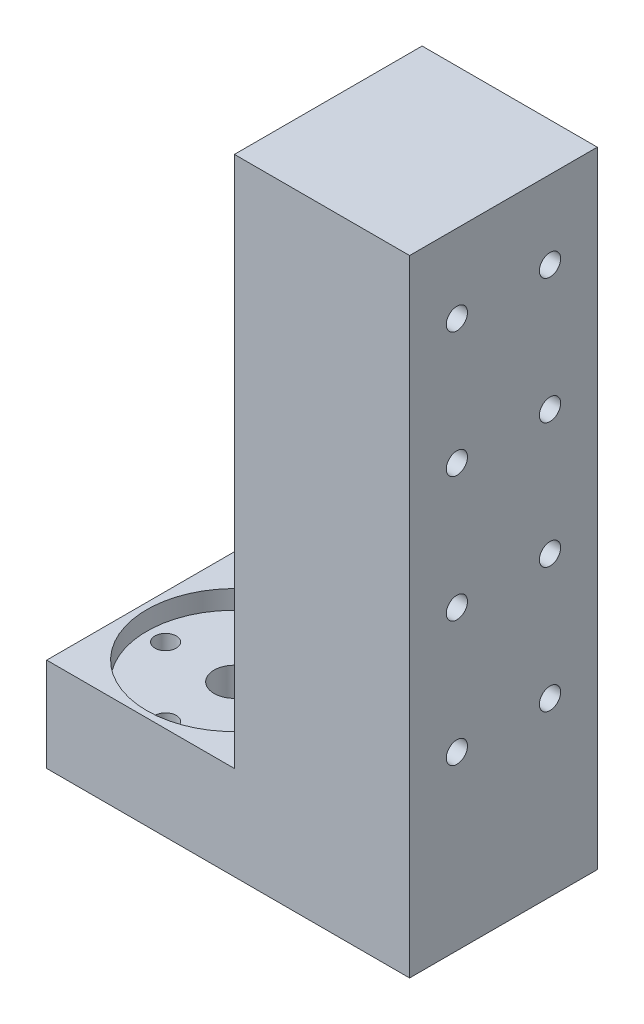
ISO-10303-21;
HEADER;
FILE_DESCRIPTION(('STEP AP214'),'2;1');
FILE_NAME('part.step','',(''),(''),'','','');
FILE_SCHEMA(('AUTOMOTIVE_DESIGN { 1 0 10303 214 1 1 1 1 }'));
ENDSEC;
DATA;
#1=APPLICATION_CONTEXT('core data for automotive mechanical design processes');
#2=APPLICATION_PROTOCOL_DEFINITION('international standard','automotive_design',2000,#1);
#3=PRODUCT_CONTEXT('',#1,'mechanical');
#4=PRODUCT('Part','Part','',(#3));
#5=PRODUCT_RELATED_PRODUCT_CATEGORY('part','',(#4));
#6=PRODUCT_DEFINITION_FORMATION('','',#4);
#7=PRODUCT_DEFINITION_CONTEXT('part definition',#1,'design');
#8=PRODUCT_DEFINITION('design','',#6,#7);
#9=PRODUCT_DEFINITION_SHAPE('','',#8);
#10=(LENGTH_UNIT() NAMED_UNIT(*) SI_UNIT(.MILLI.,.METRE.));
#11=(NAMED_UNIT(*) PLANE_ANGLE_UNIT() SI_UNIT($,.RADIAN.));
#12=(NAMED_UNIT(*) SI_UNIT($,.STERADIAN.) SOLID_ANGLE_UNIT());
#13=UNCERTAINTY_MEASURE_WITH_UNIT(LENGTH_MEASURE(1.E-05),#10,'distance_accuracy_value','');
#14=(GEOMETRIC_REPRESENTATION_CONTEXT(3) GLOBAL_UNCERTAINTY_ASSIGNED_CONTEXT((#13)) GLOBAL_UNIT_ASSIGNED_CONTEXT((#10,
#11,#12)) REPRESENTATION_CONTEXT('',''));
#15=CARTESIAN_POINT('',(0.,0.,0.));
#16=DIRECTION('',(0.,0.,1.));
#17=DIRECTION('',(1.,0.,0.));
#18=AXIS2_PLACEMENT_3D('',#15,#16,#17);
#19=CARTESIAN_POINT('',(30.,0.,30.));
#20=DIRECTION('',(0.,1.,0.));
#21=DIRECTION('',(0.,0.,1.));
#22=AXIS2_PLACEMENT_3D('',#19,#20,#21);
#23=PLANE('',#22);
#24=CARTESIAN_POINT('',(15.,0.,4.));
#25=DIRECTION('',(0.,1.,0.));
#26=DIRECTION('',(0.,0.,1.));
#27=AXIS2_PLACEMENT_3D('',#24,#25,#26);
#28=CIRCLE('',#27,1.7);
#29=CARTESIAN_POINT('',(15.,0.,5.7));
#30=VERTEX_POINT('',#29);
#31=EDGE_CURVE('E173',#30,#30,#28,.T.);
#32=ORIENTED_EDGE('',*,*,#31,.T.);
#33=EDGE_LOOP('',(#32));
#34=FACE_BOUND('',#33,.T.);
#35=CARTESIAN_POINT('',(26.,0.,15.));
#36=DIRECTION('',(0.,1.,0.));
#37=DIRECTION('',(0.,0.,1.));
#38=AXIS2_PLACEMENT_3D('',#35,#36,#37);
#39=CIRCLE('',#38,1.7);
#40=CARTESIAN_POINT('',(26.,0.,16.7));
#41=VERTEX_POINT('',#40);
#42=EDGE_CURVE('E170',#41,#41,#39,.T.);
#43=ORIENTED_EDGE('',*,*,#42,.T.);
#44=EDGE_LOOP('',(#43));
#45=FACE_BOUND('',#44,.T.);
#46=CARTESIAN_POINT('',(15.,0.,26.));
#47=DIRECTION('',(0.,1.,0.));
#48=DIRECTION('',(0.,0.,1.));
#49=AXIS2_PLACEMENT_3D('',#46,#47,#48);
#50=CIRCLE('',#49,1.7);
#51=CARTESIAN_POINT('',(15.,0.,27.7));
#52=VERTEX_POINT('',#51);
#53=EDGE_CURVE('E186',#52,#52,#50,.T.);
#54=ORIENTED_EDGE('',*,*,#53,.T.);
#55=EDGE_LOOP('',(#54));
#56=FACE_BOUND('',#55,.T.);
#57=CARTESIAN_POINT('',(4.00000000000001,0.,15.));
#58=DIRECTION('',(0.,1.,0.));
#59=DIRECTION('',(0.,0.,1.));
#60=AXIS2_PLACEMENT_3D('',#57,#58,#59);
#61=CIRCLE('',#60,1.7);
#62=CARTESIAN_POINT('',(4.00000000000001,0.,16.7));
#63=VERTEX_POINT('',#62);
#64=EDGE_CURVE('E177',#63,#63,#61,.T.);
#65=ORIENTED_EDGE('',*,*,#64,.T.);
#66=EDGE_LOOP('',(#65));
#67=FACE_BOUND('',#66,.T.);
#68=CARTESIAN_POINT('',(15.,0.,15.));
#69=DIRECTION('',(0.,1.,0.));
#70=DIRECTION('',(0.,0.,1.));
#71=AXIS2_PLACEMENT_3D('',#68,#69,#70);
#72=CIRCLE('',#71,3.25);
#73=CARTESIAN_POINT('',(15.,0.,18.25));
#74=VERTEX_POINT('',#73);
#75=EDGE_CURVE('E158',#74,#74,#72,.T.);
#76=ORIENTED_EDGE('',*,*,#75,.T.);
#77=EDGE_LOOP('',(#76));
#78=FACE_BOUND('',#77,.T.);
#79=DIRECTION('',(1.,0.,0.));
#80=VECTOR('',#79,1.);
#81=CARTESIAN_POINT('',(30.,0.,0.));
#82=LINE('',#81,#80);
#83=CARTESIAN_POINT('',(0.,0.,0.));
#84=VERTEX_POINT('',#83);
#85=CARTESIAN_POINT('',(58.,0.,0.));
#86=VERTEX_POINT('',#85);
#87=EDGE_CURVE('E90',#84,#86,#82,.T.);
#88=ORIENTED_EDGE('',*,*,#87,.T.);
#89=DIRECTION('',(0.,0.,-1.));
#90=VECTOR('',#89,1.);
#91=CARTESIAN_POINT('',(58.,0.,30.));
#92=LINE('',#91,#90);
#93=CARTESIAN_POINT('',(58.,0.,30.));
#94=VERTEX_POINT('',#93);
#95=EDGE_CURVE('E11',#94,#86,#92,.T.);
#96=ORIENTED_EDGE('',*,*,#95,.F.);
#97=DIRECTION('',(1.,0.,0.));
#98=VECTOR('',#97,1.);
#99=CARTESIAN_POINT('',(30.,0.,30.));
#100=LINE('',#99,#98);
#101=CARTESIAN_POINT('',(0.,0.,30.));
#102=VERTEX_POINT('',#101);
#103=EDGE_CURVE('E92',#102,#94,#100,.T.);
#104=ORIENTED_EDGE('',*,*,#103,.F.);
#105=DIRECTION('',(0.,0.,-1.));
#106=VECTOR('',#105,1.);
#107=CARTESIAN_POINT('',(0.,0.,30.));
#108=LINE('',#107,#106);
#109=EDGE_CURVE('E121',#102,#84,#108,.T.);
#110=ORIENTED_EDGE('',*,*,#109,.T.);
#111=EDGE_LOOP('',(#88,#96,#104,#110));
#112=FACE_BOUND('',#111,.T.);
#113=ADVANCED_FACE('F43',(#34,#45,#56,#67,#78,#112),#23,.F.);
#114=CARTESIAN_POINT('',(58.,0.,30.));
#115=DIRECTION('',(-1.,0.,0.));
#116=DIRECTION('',(0.,0.,1.));
#117=AXIS2_PLACEMENT_3D('',#114,#115,#116);
#118=PLANE('',#117);
#119=CARTESIAN_POINT('',(58.,27.5,22.4411235366858));
#120=DIRECTION('',(-1.,0.,0.));
#121=DIRECTION('',(0.,1.,0.));
#122=AXIS2_PLACEMENT_3D('',#119,#120,#121);
#123=CIRCLE('',#122,1.7);
#124=CARTESIAN_POINT('',(58.,29.2,22.4411235366858));
#125=VERTEX_POINT('',#124);
#126=EDGE_CURVE('E207',#125,#125,#123,.T.);
#127=ORIENTED_EDGE('',*,*,#126,.T.);
#128=EDGE_LOOP('',(#127));
#129=FACE_BOUND('',#128,.T.);
#130=CARTESIAN_POINT('',(58.,87.5,7.55887646331421));
#131=DIRECTION('',(-1.,0.,0.));
#132=DIRECTION('',(0.,-1.,0.));
#133=AXIS2_PLACEMENT_3D('',#130,#131,#132);
#134=CIRCLE('',#133,1.7);
#135=CARTESIAN_POINT('',(58.,85.8,7.55887646331421));
#136=VERTEX_POINT('',#135);
#137=EDGE_CURVE('E216',#136,#136,#134,.T.);
#138=ORIENTED_EDGE('',*,*,#137,.T.);
#139=EDGE_LOOP('',(#138));
#140=FACE_BOUND('',#139,.T.);
#141=CARTESIAN_POINT('',(58.,67.5,7.55887646331421));
#142=DIRECTION('',(-1.,0.,0.));
#143=DIRECTION('',(0.,-1.,0.));
#144=AXIS2_PLACEMENT_3D('',#141,#142,#143);
#145=CIRCLE('',#144,1.7);
#146=CARTESIAN_POINT('',(58.,65.8,7.55887646331421));
#147=VERTEX_POINT('',#146);
#148=EDGE_CURVE('E197',#147,#147,#145,.T.);
#149=ORIENTED_EDGE('',*,*,#148,.T.);
#150=EDGE_LOOP('',(#149));
#151=FACE_BOUND('',#150,.T.);
#152=CARTESIAN_POINT('',(58.,47.5,7.55887646331421));
#153=DIRECTION('',(-1.,0.,0.));
#154=DIRECTION('',(0.,-1.,0.));
#155=AXIS2_PLACEMENT_3D('',#152,#153,#154);
#156=CIRCLE('',#155,1.7);
#157=CARTESIAN_POINT('',(58.,45.8,7.55887646331421));
#158=VERTEX_POINT('',#157);
#159=EDGE_CURVE('E204',#158,#158,#156,.T.);
#160=ORIENTED_EDGE('',*,*,#159,.T.);
#161=EDGE_LOOP('',(#160));
#162=FACE_BOUND('',#161,.T.);
#163=CARTESIAN_POINT('',(58.,47.5,22.4411235366858));
#164=DIRECTION('',(-1.,0.,0.));
#165=DIRECTION('',(0.,1.,0.));
#166=AXIS2_PLACEMENT_3D('',#163,#164,#165);
#167=CIRCLE('',#166,1.7);
#168=CARTESIAN_POINT('',(58.,49.2,22.4411235366858));
#169=VERTEX_POINT('',#168);
#170=EDGE_CURVE('E231',#169,#169,#167,.T.);
#171=ORIENTED_EDGE('',*,*,#170,.T.);
#172=EDGE_LOOP('',(#171));
#173=FACE_BOUND('',#172,.T.);
#174=CARTESIAN_POINT('',(58.,67.5,22.4411235366858));
#175=DIRECTION('',(-1.,0.,0.));
#176=DIRECTION('',(0.,1.,0.));
#177=AXIS2_PLACEMENT_3D('',#174,#175,#176);
#178=CIRCLE('',#177,1.7);
#179=CARTESIAN_POINT('',(58.,69.2,22.4411235366858));
#180=VERTEX_POINT('',#179);
#181=EDGE_CURVE('E227',#180,#180,#178,.T.);
#182=ORIENTED_EDGE('',*,*,#181,.T.);
#183=EDGE_LOOP('',(#182));
#184=FACE_BOUND('',#183,.T.);
#185=CARTESIAN_POINT('',(58.,87.5,22.4411235366858));
#186=DIRECTION('',(-1.,0.,0.));
#187=DIRECTION('',(0.,1.,0.));
#188=AXIS2_PLACEMENT_3D('',#185,#186,#187);
#189=CIRCLE('',#188,1.7);
#190=CARTESIAN_POINT('',(58.,89.2,22.4411235366858));
#191=VERTEX_POINT('',#190);
#192=EDGE_CURVE('E222',#191,#191,#189,.T.);
#193=ORIENTED_EDGE('',*,*,#192,.T.);
#194=EDGE_LOOP('',(#193));
#195=FACE_BOUND('',#194,.T.);
#196=CARTESIAN_POINT('',(58.,27.5,7.55887646331421));
#197=DIRECTION('',(-1.,0.,0.));
#198=DIRECTION('',(0.,-1.,0.));
#199=AXIS2_PLACEMENT_3D('',#196,#197,#198);
#200=CIRCLE('',#199,1.7);
#201=CARTESIAN_POINT('',(58.,25.8,7.55887646331421));
#202=VERTEX_POINT('',#201);
#203=EDGE_CURVE('E181',#202,#202,#200,.T.);
#204=ORIENTED_EDGE('',*,*,#203,.T.);
#205=EDGE_LOOP('',(#204));
#206=FACE_BOUND('',#205,.T.);
#207=DIRECTION('',(0.,1.,0.));
#208=VECTOR('',#207,1.);
#209=CARTESIAN_POINT('',(58.,0.,0.));
#210=LINE('',#209,#208);
#211=CARTESIAN_POINT('',(58.,100.,0.));
#212=VERTEX_POINT('',#211);
#213=EDGE_CURVE('E126',#86,#212,#210,.T.);
#214=ORIENTED_EDGE('',*,*,#213,.T.);
#215=DIRECTION('',(0.,0.,-1.));
#216=VECTOR('',#215,1.);
#217=CARTESIAN_POINT('',(58.,100.,30.));
#218=LINE('',#217,#216);
#219=CARTESIAN_POINT('',(58.,100.,30.));
#220=VERTEX_POINT('',#219);
#221=EDGE_CURVE('E51',#220,#212,#218,.T.);
#222=ORIENTED_EDGE('',*,*,#221,.F.);
#223=DIRECTION('',(0.,1.,0.));
#224=VECTOR('',#223,1.);
#225=CARTESIAN_POINT('',(58.,0.,30.));
#226=LINE('',#225,#224);
#227=EDGE_CURVE('E151',#94,#220,#226,.T.);
#228=ORIENTED_EDGE('',*,*,#227,.F.);
#229=ORIENTED_EDGE('',*,*,#95,.T.);
#230=EDGE_LOOP('',(#214,#222,#228,#229));
#231=FACE_BOUND('',#230,.T.);
#232=ADVANCED_FACE('F271',(#129,#140,#151,#162,#173,#184,#195,#206,#231),#118,.F.);
#233=CARTESIAN_POINT('',(58.,100.,30.));
#234=DIRECTION('',(0.,-1.,0.));
#235=DIRECTION('',(0.,0.,-1.));
#236=AXIS2_PLACEMENT_3D('',#233,#234,#235);
#237=PLANE('',#236);
#238=DIRECTION('',(-1.,0.,0.));
#239=VECTOR('',#238,1.);
#240=CARTESIAN_POINT('',(58.,100.,0.));
#241=LINE('',#240,#239);
#242=CARTESIAN_POINT('',(30.,100.,0.));
#243=VERTEX_POINT('',#242);
#244=EDGE_CURVE('E131',#212,#243,#241,.T.);
#245=ORIENTED_EDGE('',*,*,#244,.T.);
#246=DIRECTION('',(0.,0.,-1.));
#247=VECTOR('',#246,1.);
#248=CARTESIAN_POINT('',(30.,100.,30.));
#249=LINE('',#248,#247);
#250=CARTESIAN_POINT('',(30.,100.,30.));
#251=VERTEX_POINT('',#250);
#252=EDGE_CURVE('E119',#251,#243,#249,.T.);
#253=ORIENTED_EDGE('',*,*,#252,.F.);
#254=DIRECTION('',(-1.,0.,0.));
#255=VECTOR('',#254,1.);
#256=CARTESIAN_POINT('',(58.,100.,30.));
#257=LINE('',#256,#255);
#258=EDGE_CURVE('E108',#220,#251,#257,.T.);
#259=ORIENTED_EDGE('',*,*,#258,.F.);
#260=ORIENTED_EDGE('',*,*,#221,.T.);
#261=EDGE_LOOP('',(#245,#253,#259,#260));
#262=FACE_BOUND('',#261,.T.);
#263=ADVANCED_FACE('F145',(#262),#237,.F.);
#264=CARTESIAN_POINT('',(30.,100.,30.));
#265=DIRECTION('',(1.,0.,0.));
#266=DIRECTION('',(0.,1.,0.));
#267=AXIS2_PLACEMENT_3D('',#264,#265,#266);
#268=PLANE('',#267);
#269=CARTESIAN_POINT('',(30.,27.5,22.4411235366858));
#270=DIRECTION('',(-1.,0.,0.));
#271=DIRECTION('',(0.,1.,0.));
#272=AXIS2_PLACEMENT_3D('',#269,#270,#271);
#273=CIRCLE('',#272,1.7);
#274=CARTESIAN_POINT('',(30.,29.2,22.4411235366858));
#275=VERTEX_POINT('',#274);
#276=EDGE_CURVE('E215',#275,#275,#273,.T.);
#277=ORIENTED_EDGE('',*,*,#276,.F.);
#278=EDGE_LOOP('',(#277));
#279=FACE_BOUND('',#278,.T.);
#280=CARTESIAN_POINT('',(30.,87.5,7.55887646331421));
#281=DIRECTION('',(-1.,0.,0.));
#282=DIRECTION('',(0.,-1.,0.));
#283=AXIS2_PLACEMENT_3D('',#280,#281,#282);
#284=CIRCLE('',#283,1.7);
#285=CARTESIAN_POINT('',(30.,85.8,7.55887646331421));
#286=VERTEX_POINT('',#285);
#287=EDGE_CURVE('E203',#286,#286,#284,.T.);
#288=ORIENTED_EDGE('',*,*,#287,.F.);
#289=EDGE_LOOP('',(#288));
#290=FACE_BOUND('',#289,.T.);
#291=CARTESIAN_POINT('',(30.,67.5,7.55887646331421));
#292=DIRECTION('',(-1.,0.,0.));
#293=DIRECTION('',(0.,-1.,0.));
#294=AXIS2_PLACEMENT_3D('',#291,#292,#293);
#295=CIRCLE('',#294,1.7);
#296=CARTESIAN_POINT('',(30.,65.8,7.55887646331421));
#297=VERTEX_POINT('',#296);
#298=EDGE_CURVE('E199',#297,#297,#295,.T.);
#299=ORIENTED_EDGE('',*,*,#298,.F.);
#300=EDGE_LOOP('',(#299));
#301=FACE_BOUND('',#300,.T.);
#302=CARTESIAN_POINT('',(30.,47.5,7.55887646331421));
#303=DIRECTION('',(-1.,0.,0.));
#304=DIRECTION('',(0.,-1.,0.));
#305=AXIS2_PLACEMENT_3D('',#302,#303,#304);
#306=CIRCLE('',#305,1.7);
#307=CARTESIAN_POINT('',(30.,45.8,7.55887646331421));
#308=VERTEX_POINT('',#307);
#309=EDGE_CURVE('E192',#308,#308,#306,.T.);
#310=ORIENTED_EDGE('',*,*,#309,.F.);
#311=EDGE_LOOP('',(#310));
#312=FACE_BOUND('',#311,.T.);
#313=CARTESIAN_POINT('',(30.,47.5,22.4411235366858));
#314=DIRECTION('',(-1.,0.,0.));
#315=DIRECTION('',(0.,1.,0.));
#316=AXIS2_PLACEMENT_3D('',#313,#314,#315);
#317=CIRCLE('',#316,1.7);
#318=CARTESIAN_POINT('',(30.,49.2,22.4411235366858));
#319=VERTEX_POINT('',#318);
#320=EDGE_CURVE('E213',#319,#319,#317,.T.);
#321=ORIENTED_EDGE('',*,*,#320,.F.);
#322=EDGE_LOOP('',(#321));
#323=FACE_BOUND('',#322,.T.);
#324=CARTESIAN_POINT('',(30.,67.5,22.4411235366858));
#325=DIRECTION('',(-1.,0.,0.));
#326=DIRECTION('',(0.,1.,0.));
#327=AXIS2_PLACEMENT_3D('',#324,#325,#326);
#328=CIRCLE('',#327,1.7);
#329=CARTESIAN_POINT('',(30.,69.2,22.4411235366858));
#330=VERTEX_POINT('',#329);
#331=EDGE_CURVE('E230',#330,#330,#328,.T.);
#332=ORIENTED_EDGE('',*,*,#331,.F.);
#333=EDGE_LOOP('',(#332));
#334=FACE_BOUND('',#333,.T.);
#335=CARTESIAN_POINT('',(30.,87.5,22.4411235366858));
#336=DIRECTION('',(-1.,0.,0.));
#337=DIRECTION('',(0.,1.,0.));
#338=AXIS2_PLACEMENT_3D('',#335,#336,#337);
#339=CIRCLE('',#338,1.7);
#340=CARTESIAN_POINT('',(30.,89.2,22.4411235366858));
#341=VERTEX_POINT('',#340);
#342=EDGE_CURVE('E221',#341,#341,#339,.T.);
#343=ORIENTED_EDGE('',*,*,#342,.F.);
#344=EDGE_LOOP('',(#343));
#345=FACE_BOUND('',#344,.T.);
#346=CARTESIAN_POINT('',(30.,27.5,7.55887646331421));
#347=DIRECTION('',(-1.,0.,0.));
#348=DIRECTION('',(0.,-1.,0.));
#349=AXIS2_PLACEMENT_3D('',#346,#347,#348);
#350=CIRCLE('',#349,1.7);
#351=CARTESIAN_POINT('',(30.,25.8,7.55887646331421));
#352=VERTEX_POINT('',#351);
#353=EDGE_CURVE('E193',#352,#352,#350,.T.);
#354=ORIENTED_EDGE('',*,*,#353,.F.);
#355=EDGE_LOOP('',(#354));
#356=FACE_BOUND('',#355,.T.);
#357=DIRECTION('',(0.,-1.,0.));
#358=VECTOR('',#357,1.);
#359=CARTESIAN_POINT('',(30.,100.,0.));
#360=LINE('',#359,#358);
#361=CARTESIAN_POINT('',(30.,15.,0.));
#362=VERTEX_POINT('',#361);
#363=EDGE_CURVE('E117',#243,#362,#360,.T.);
#364=ORIENTED_EDGE('',*,*,#363,.T.);
#365=DIRECTION('',(0.,0.,-1.));
#366=VECTOR('',#365,1.);
#367=CARTESIAN_POINT('',(30.,15.,30.));
#368=LINE('',#367,#366);
#369=CARTESIAN_POINT('',(30.,15.,30.));
#370=VERTEX_POINT('',#369);
#371=EDGE_CURVE('E111',#370,#362,#368,.T.);
#372=ORIENTED_EDGE('',*,*,#371,.F.);
#373=DIRECTION('',(0.,-1.,0.));
#374=VECTOR('',#373,1.);
#375=CARTESIAN_POINT('',(30.,100.,30.));
#376=LINE('',#375,#374);
#377=EDGE_CURVE('E103',#251,#370,#376,.T.);
#378=ORIENTED_EDGE('',*,*,#377,.F.);
#379=ORIENTED_EDGE('',*,*,#252,.T.);
#380=EDGE_LOOP('',(#364,#372,#378,#379));
#381=FACE_BOUND('',#380,.T.);
#382=ADVANCED_FACE('F113',(#279,#290,#301,#312,#323,#334,#345,#356,#381),#268,.F.);
#383=CARTESIAN_POINT('',(0.,15.,30.));
#384=DIRECTION('',(0.,-1.,0.));
#385=DIRECTION('',(0.,0.,-1.));
#386=AXIS2_PLACEMENT_3D('',#383,#384,#385);
#387=PLANE('',#386);
#388=CARTESIAN_POINT('',(15.,15.,15.));
#389=DIRECTION('',(0.,1.,0.));
#390=DIRECTION('',(0.,0.,1.));
#391=AXIS2_PLACEMENT_3D('',#388,#389,#390);
#392=CIRCLE('',#391,14.);
#393=CARTESIAN_POINT('',(15.,15.,29.));
#394=VERTEX_POINT('',#393);
#395=EDGE_CURVE('E154',#394,#394,#392,.T.);
#396=ORIENTED_EDGE('',*,*,#395,.F.);
#397=EDGE_LOOP('',(#396));
#398=FACE_BOUND('',#397,.T.);
#399=DIRECTION('',(-1.,0.,0.));
#400=VECTOR('',#399,1.);
#401=CARTESIAN_POINT('',(0.,15.,0.));
#402=LINE('',#401,#400);
#403=CARTESIAN_POINT('',(0.,15.,0.));
#404=VERTEX_POINT('',#403);
#405=EDGE_CURVE('E85',#362,#404,#402,.T.);
#406=ORIENTED_EDGE('',*,*,#405,.T.);
#407=DIRECTION('',(0.,0.,-1.));
#408=VECTOR('',#407,1.);
#409=CARTESIAN_POINT('',(0.,15.,30.));
#410=LINE('',#409,#408);
#411=CARTESIAN_POINT('',(0.,15.,30.));
#412=VERTEX_POINT('',#411);
#413=EDGE_CURVE('E118',#412,#404,#410,.T.);
#414=ORIENTED_EDGE('',*,*,#413,.F.);
#415=DIRECTION('',(-1.,0.,0.));
#416=VECTOR('',#415,1.);
#417=CARTESIAN_POINT('',(0.,15.,30.));
#418=LINE('',#417,#416);
#419=EDGE_CURVE('E110',#370,#412,#418,.T.);
#420=ORIENTED_EDGE('',*,*,#419,.F.);
#421=ORIENTED_EDGE('',*,*,#371,.T.);
#422=EDGE_LOOP('',(#406,#414,#420,#421));
#423=FACE_BOUND('',#422,.T.);
#424=ADVANCED_FACE('F123',(#398,#423),#387,.F.);
#425=CARTESIAN_POINT('',(0.,0.,30.));
#426=DIRECTION('',(1.,0.,0.));
#427=DIRECTION('',(0.,0.,-1.));
#428=AXIS2_PLACEMENT_3D('',#425,#426,#427);
#429=PLANE('',#428);
#430=DIRECTION('',(0.,-1.,0.));
#431=VECTOR('',#430,1.);
#432=CARTESIAN_POINT('',(0.,0.,0.));
#433=LINE('',#432,#431);
#434=EDGE_CURVE('E135',#404,#84,#433,.T.);
#435=ORIENTED_EDGE('',*,*,#434,.T.);
#436=ORIENTED_EDGE('',*,*,#109,.F.);
#437=DIRECTION('',(0.,-1.,0.));
#438=VECTOR('',#437,1.);
#439=CARTESIAN_POINT('',(0.,0.,30.));
#440=LINE('',#439,#438);
#441=EDGE_CURVE('E56',#412,#102,#440,.T.);
#442=ORIENTED_EDGE('',*,*,#441,.F.);
#443=ORIENTED_EDGE('',*,*,#413,.T.);
#444=EDGE_LOOP('',(#435,#436,#442,#443));
#445=FACE_BOUND('',#444,.T.);
#446=ADVANCED_FACE('F149',(#445),#429,.F.);
#447=CARTESIAN_POINT('',(0.,0.,30.));
#448=DIRECTION('',(0.,0.,-1.));
#449=DIRECTION('',(-1.,0.,0.));
#450=AXIS2_PLACEMENT_3D('',#447,#448,#449);
#451=PLANE('',#450);
#452=ORIENTED_EDGE('',*,*,#103,.T.);
#453=ORIENTED_EDGE('',*,*,#227,.T.);
#454=ORIENTED_EDGE('',*,*,#258,.T.);
#455=ORIENTED_EDGE('',*,*,#377,.T.);
#456=ORIENTED_EDGE('',*,*,#419,.T.);
#457=ORIENTED_EDGE('',*,*,#441,.T.);
#458=EDGE_LOOP('',(#452,#453,#454,#455,#456,#457));
#459=FACE_BOUND('',#458,.T.);
#460=ADVANCED_FACE('F104',(#459),#451,.F.);
#461=CARTESIAN_POINT('',(0.,0.,0.));
#462=DIRECTION('',(0.,0.,-1.));
#463=DIRECTION('',(-1.,0.,0.));
#464=AXIS2_PLACEMENT_3D('',#461,#462,#463);
#465=PLANE('',#464);
#466=ORIENTED_EDGE('',*,*,#87,.F.);
#467=ORIENTED_EDGE('',*,*,#434,.F.);
#468=ORIENTED_EDGE('',*,*,#405,.F.);
#469=ORIENTED_EDGE('',*,*,#363,.F.);
#470=ORIENTED_EDGE('',*,*,#244,.F.);
#471=ORIENTED_EDGE('',*,*,#213,.F.);
#472=EDGE_LOOP('',(#466,#467,#468,#469,#470,#471));
#473=FACE_BOUND('',#472,.T.);
#474=ADVANCED_FACE('F150',(#473),#465,.T.);
#475=CARTESIAN_POINT('',(15.,12.,15.));
#476=DIRECTION('',(0.,1.,0.));
#477=DIRECTION('',(0.,0.,1.));
#478=AXIS2_PLACEMENT_3D('',#475,#476,#477);
#479=CYLINDRICAL_SURFACE('',#478,14.);
#480=CARTESIAN_POINT('',(15.,12.,15.));
#481=DIRECTION('',(0.,1.,0.));
#482=DIRECTION('',(0.,0.,1.));
#483=AXIS2_PLACEMENT_3D('',#480,#481,#482);
#484=CIRCLE('',#483,14.);
#485=CARTESIAN_POINT('',(15.,12.,29.));
#486=VERTEX_POINT('',#485);
#487=EDGE_CURVE('E129',#486,#486,#484,.T.);
#488=ORIENTED_EDGE('',*,*,#487,.F.);
#489=EDGE_LOOP('',(#488));
#490=FACE_BOUND('',#489,.T.);
#491=ORIENTED_EDGE('',*,*,#395,.T.);
#492=EDGE_LOOP('',(#491));
#493=FACE_BOUND('',#492,.T.);
#494=ADVANCED_FACE('F299',(#490,#493),#479,.F.);
#495=CARTESIAN_POINT('',(15.,12.,15.));
#496=DIRECTION('',(0.,1.,0.));
#497=DIRECTION('',(0.,0.,1.));
#498=AXIS2_PLACEMENT_3D('',#495,#496,#497);
#499=PLANE('',#498);
#500=CARTESIAN_POINT('',(15.,12.,4.));
#501=DIRECTION('',(0.,1.,0.));
#502=DIRECTION('',(0.,0.,1.));
#503=AXIS2_PLACEMENT_3D('',#500,#501,#502);
#504=CIRCLE('',#503,1.7);
#505=CARTESIAN_POINT('',(15.,12.,5.7));
#506=VERTEX_POINT('',#505);
#507=EDGE_CURVE('E163',#506,#506,#504,.T.);
#508=ORIENTED_EDGE('',*,*,#507,.F.);
#509=EDGE_LOOP('',(#508));
#510=FACE_BOUND('',#509,.T.);
#511=CARTESIAN_POINT('',(26.,12.,15.));
#512=DIRECTION('',(0.,1.,0.));
#513=DIRECTION('',(0.,0.,1.));
#514=AXIS2_PLACEMENT_3D('',#511,#512,#513);
#515=CIRCLE('',#514,1.7);
#516=CARTESIAN_POINT('',(26.,12.,16.7));
#517=VERTEX_POINT('',#516);
#518=EDGE_CURVE('E168',#517,#517,#515,.T.);
#519=ORIENTED_EDGE('',*,*,#518,.F.);
#520=EDGE_LOOP('',(#519));
#521=FACE_BOUND('',#520,.T.);
#522=CARTESIAN_POINT('',(15.,12.,26.));
#523=DIRECTION('',(0.,1.,0.));
#524=DIRECTION('',(0.,0.,1.));
#525=AXIS2_PLACEMENT_3D('',#522,#523,#524);
#526=CIRCLE('',#525,1.7);
#527=CARTESIAN_POINT('',(15.,12.,27.7));
#528=VERTEX_POINT('',#527);
#529=EDGE_CURVE('E171',#528,#528,#526,.T.);
#530=ORIENTED_EDGE('',*,*,#529,.F.);
#531=EDGE_LOOP('',(#530));
#532=FACE_BOUND('',#531,.T.);
#533=CARTESIAN_POINT('',(4.00000000000001,12.,15.));
#534=DIRECTION('',(0.,1.,0.));
#535=DIRECTION('',(0.,0.,1.));
#536=AXIS2_PLACEMENT_3D('',#533,#534,#535);
#537=CIRCLE('',#536,1.7);
#538=CARTESIAN_POINT('',(4.00000000000001,12.,16.7));
#539=VERTEX_POINT('',#538);
#540=EDGE_CURVE('E185',#539,#539,#537,.T.);
#541=ORIENTED_EDGE('',*,*,#540,.F.);
#542=EDGE_LOOP('',(#541));
#543=FACE_BOUND('',#542,.T.);
#544=CARTESIAN_POINT('',(15.,12.,15.));
#545=DIRECTION('',(0.,1.,0.));
#546=DIRECTION('',(0.,0.,1.));
#547=AXIS2_PLACEMENT_3D('',#544,#545,#546);
#548=CIRCLE('',#547,3.25);
#549=CARTESIAN_POINT('',(15.,12.,18.25));
#550=VERTEX_POINT('',#549);
#551=EDGE_CURVE('E161',#550,#550,#548,.T.);
#552=ORIENTED_EDGE('',*,*,#551,.F.);
#553=EDGE_LOOP('',(#552));
#554=FACE_BOUND('',#553,.T.);
#555=ORIENTED_EDGE('',*,*,#487,.T.);
#556=EDGE_LOOP('',(#555));
#557=FACE_BOUND('',#556,.T.);
#558=ADVANCED_FACE('F291',(#510,#521,#532,#543,#554,#557),#499,.T.);
#559=CARTESIAN_POINT('',(15.,0.,15.));
#560=DIRECTION('',(0.,1.,0.));
#561=DIRECTION('',(0.,0.,1.));
#562=AXIS2_PLACEMENT_3D('',#559,#560,#561);
#563=CYLINDRICAL_SURFACE('',#562,3.25);
#564=ORIENTED_EDGE('',*,*,#75,.F.);
#565=EDGE_LOOP('',(#564));
#566=FACE_BOUND('',#565,.T.);
#567=ORIENTED_EDGE('',*,*,#551,.T.);
#568=EDGE_LOOP('',(#567));
#569=FACE_BOUND('',#568,.T.);
#570=ADVANCED_FACE('F287',(#566,#569),#563,.F.);
#571=CARTESIAN_POINT('',(4.00000000000001,0.,15.));
#572=DIRECTION('',(0.,1.,0.));
#573=DIRECTION('',(0.,0.,1.));
#574=AXIS2_PLACEMENT_3D('',#571,#572,#573);
#575=CYLINDRICAL_SURFACE('',#574,1.7);
#576=ORIENTED_EDGE('',*,*,#64,.F.);
#577=EDGE_LOOP('',(#576));
#578=FACE_BOUND('',#577,.T.);
#579=ORIENTED_EDGE('',*,*,#540,.T.);
#580=EDGE_LOOP('',(#579));
#581=FACE_BOUND('',#580,.T.);
#582=ADVANCED_FACE('F295',(#578,#581),#575,.F.);
#583=CARTESIAN_POINT('',(15.,0.,26.));
#584=DIRECTION('',(0.,1.,0.));
#585=DIRECTION('',(0.,0.,1.));
#586=AXIS2_PLACEMENT_3D('',#583,#584,#585);
#587=CYLINDRICAL_SURFACE('',#586,1.7);
#588=ORIENTED_EDGE('',*,*,#53,.F.);
#589=EDGE_LOOP('',(#588));
#590=FACE_BOUND('',#589,.T.);
#591=ORIENTED_EDGE('',*,*,#529,.T.);
#592=EDGE_LOOP('',(#591));
#593=FACE_BOUND('',#592,.T.);
#594=ADVANCED_FACE('F368',(#590,#593),#587,.F.);
#595=CARTESIAN_POINT('',(26.,0.,15.));
#596=DIRECTION('',(0.,1.,0.));
#597=DIRECTION('',(0.,0.,1.));
#598=AXIS2_PLACEMENT_3D('',#595,#596,#597);
#599=CYLINDRICAL_SURFACE('',#598,1.7);
#600=ORIENTED_EDGE('',*,*,#42,.F.);
#601=EDGE_LOOP('',(#600));
#602=FACE_BOUND('',#601,.T.);
#603=ORIENTED_EDGE('',*,*,#518,.T.);
#604=EDGE_LOOP('',(#603));
#605=FACE_BOUND('',#604,.T.);
#606=ADVANCED_FACE('F262',(#602,#605),#599,.F.);
#607=CARTESIAN_POINT('',(15.,0.,4.));
#608=DIRECTION('',(0.,1.,0.));
#609=DIRECTION('',(0.,0.,1.));
#610=AXIS2_PLACEMENT_3D('',#607,#608,#609);
#611=CYLINDRICAL_SURFACE('',#610,1.7);
#612=ORIENTED_EDGE('',*,*,#31,.F.);
#613=EDGE_LOOP('',(#612));
#614=FACE_BOUND('',#613,.T.);
#615=ORIENTED_EDGE('',*,*,#507,.T.);
#616=EDGE_LOOP('',(#615));
#617=FACE_BOUND('',#616,.T.);
#618=ADVANCED_FACE('F255',(#614,#617),#611,.F.);
#619=CARTESIAN_POINT('',(58.,27.5,7.55887646331421));
#620=DIRECTION('',(-1.,0.,0.));
#621=DIRECTION('',(0.,-1.,0.));
#622=AXIS2_PLACEMENT_3D('',#619,#620,#621);
#623=CYLINDRICAL_SURFACE('',#622,1.7);
#624=ORIENTED_EDGE('',*,*,#203,.F.);
#625=EDGE_LOOP('',(#624));
#626=FACE_BOUND('',#625,.T.);
#627=ORIENTED_EDGE('',*,*,#353,.T.);
#628=EDGE_LOOP('',(#627));
#629=FACE_BOUND('',#628,.T.);
#630=ADVANCED_FACE('F253',(#626,#629),#623,.F.);
#631=CARTESIAN_POINT('',(58.,87.5,22.4411235366858));
#632=DIRECTION('',(-1.,0.,0.));
#633=DIRECTION('',(0.,-1.,0.));
#634=AXIS2_PLACEMENT_3D('',#631,#632,#633);
#635=CYLINDRICAL_SURFACE('',#634,1.7);
#636=ORIENTED_EDGE('',*,*,#192,.F.);
#637=EDGE_LOOP('',(#636));
#638=FACE_BOUND('',#637,.T.);
#639=ORIENTED_EDGE('',*,*,#342,.T.);
#640=EDGE_LOOP('',(#639));
#641=FACE_BOUND('',#640,.T.);
#642=ADVANCED_FACE('F251',(#638,#641),#635,.F.);
#643=CARTESIAN_POINT('',(58.,67.5,22.4411235366858));
#644=DIRECTION('',(-1.,0.,0.));
#645=DIRECTION('',(0.,-1.,0.));
#646=AXIS2_PLACEMENT_3D('',#643,#644,#645);
#647=CYLINDRICAL_SURFACE('',#646,1.7);
#648=ORIENTED_EDGE('',*,*,#181,.F.);
#649=EDGE_LOOP('',(#648));
#650=FACE_BOUND('',#649,.T.);
#651=ORIENTED_EDGE('',*,*,#331,.T.);
#652=EDGE_LOOP('',(#651));
#653=FACE_BOUND('',#652,.T.);
#654=ADVANCED_FACE('F257',(#650,#653),#647,.F.);
#655=CARTESIAN_POINT('',(58.,47.5,22.4411235366858));
#656=DIRECTION('',(-1.,0.,0.));
#657=DIRECTION('',(0.,-1.,0.));
#658=AXIS2_PLACEMENT_3D('',#655,#656,#657);
#659=CYLINDRICAL_SURFACE('',#658,1.7);
#660=ORIENTED_EDGE('',*,*,#170,.F.);
#661=EDGE_LOOP('',(#660));
#662=FACE_BOUND('',#661,.T.);
#663=ORIENTED_EDGE('',*,*,#320,.T.);
#664=EDGE_LOOP('',(#663));
#665=FACE_BOUND('',#664,.T.);
#666=ADVANCED_FACE('F239',(#662,#665),#659,.F.);
#667=CARTESIAN_POINT('',(58.,47.5,7.55887646331421));
#668=DIRECTION('',(-1.,0.,0.));
#669=DIRECTION('',(0.,-1.,0.));
#670=AXIS2_PLACEMENT_3D('',#667,#668,#669);
#671=CYLINDRICAL_SURFACE('',#670,1.7);
#672=ORIENTED_EDGE('',*,*,#159,.F.);
#673=EDGE_LOOP('',(#672));
#674=FACE_BOUND('',#673,.T.);
#675=ORIENTED_EDGE('',*,*,#309,.T.);
#676=EDGE_LOOP('',(#675));
#677=FACE_BOUND('',#676,.T.);
#678=ADVANCED_FACE('F416',(#674,#677),#671,.F.);
#679=CARTESIAN_POINT('',(58.,67.5,7.55887646331421));
#680=DIRECTION('',(-1.,0.,0.));
#681=DIRECTION('',(0.,-1.,0.));
#682=AXIS2_PLACEMENT_3D('',#679,#680,#681);
#683=CYLINDRICAL_SURFACE('',#682,1.7);
#684=ORIENTED_EDGE('',*,*,#148,.F.);
#685=EDGE_LOOP('',(#684));
#686=FACE_BOUND('',#685,.T.);
#687=ORIENTED_EDGE('',*,*,#298,.T.);
#688=EDGE_LOOP('',(#687));
#689=FACE_BOUND('',#688,.T.);
#690=ADVANCED_FACE('F428',(#686,#689),#683,.F.);
#691=CARTESIAN_POINT('',(58.,87.5,7.55887646331421));
#692=DIRECTION('',(-1.,0.,0.));
#693=DIRECTION('',(0.,-1.,0.));
#694=AXIS2_PLACEMENT_3D('',#691,#692,#693);
#695=CYLINDRICAL_SURFACE('',#694,1.7);
#696=ORIENTED_EDGE('',*,*,#137,.F.);
#697=EDGE_LOOP('',(#696));
#698=FACE_BOUND('',#697,.T.);
#699=ORIENTED_EDGE('',*,*,#287,.T.);
#700=EDGE_LOOP('',(#699));
#701=FACE_BOUND('',#700,.T.);
#702=ADVANCED_FACE('F437',(#698,#701),#695,.F.);
#703=CARTESIAN_POINT('',(58.,27.5,22.4411235366858));
#704=DIRECTION('',(-1.,0.,0.));
#705=DIRECTION('',(0.,-1.,0.));
#706=AXIS2_PLACEMENT_3D('',#703,#704,#705);
#707=CYLINDRICAL_SURFACE('',#706,1.7);
#708=ORIENTED_EDGE('',*,*,#126,.F.);
#709=EDGE_LOOP('',(#708));
#710=FACE_BOUND('',#709,.T.);
#711=ORIENTED_EDGE('',*,*,#276,.T.);
#712=EDGE_LOOP('',(#711));
#713=FACE_BOUND('',#712,.T.);
#714=ADVANCED_FACE('F447',(#710,#713),#707,.F.);
#715=CLOSED_SHELL('',(#113,#232,#263,#382,#424,#446,#460,#474,#494,#558,#570,#582,#594,#606,
#618,#630,#642,#654,#666,#678,#690,#702,#714));
#716=MANIFOLD_SOLID_BREP('B2',#715);
#717=ADVANCED_BREP_SHAPE_REPRESENTATION('',(#18,#716),#14);
#718=SHAPE_DEFINITION_REPRESENTATION(#9,#717);
ENDSEC;
END-ISO-10303-21;
